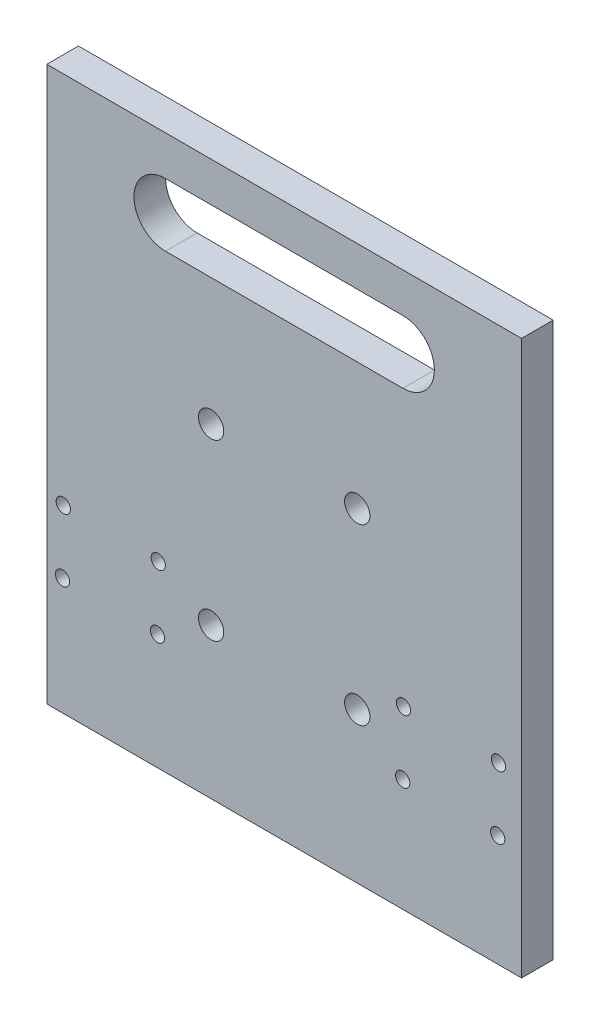
ISO-10303-21;
HEADER;
FILE_DESCRIPTION(('STEP AP214'),'2;1');
FILE_NAME('part.step','',(''),(''),'','','');
FILE_SCHEMA(('AUTOMOTIVE_DESIGN { 1 0 10303 214 1 1 1 1 }'));
ENDSEC;
DATA;
#1=APPLICATION_CONTEXT('core data for automotive mechanical design processes');
#2=APPLICATION_PROTOCOL_DEFINITION('international standard','automotive_design',2000,#1);
#3=PRODUCT_CONTEXT('',#1,'mechanical');
#4=PRODUCT('Part','Part','',(#3));
#5=PRODUCT_RELATED_PRODUCT_CATEGORY('part','',(#4));
#6=PRODUCT_DEFINITION_FORMATION('','',#4);
#7=PRODUCT_DEFINITION_CONTEXT('part definition',#1,'design');
#8=PRODUCT_DEFINITION('design','',#6,#7);
#9=PRODUCT_DEFINITION_SHAPE('','',#8);
#10=(LENGTH_UNIT() NAMED_UNIT(*) SI_UNIT(.MILLI.,.METRE.));
#11=(NAMED_UNIT(*) PLANE_ANGLE_UNIT() SI_UNIT($,.RADIAN.));
#12=(NAMED_UNIT(*) SI_UNIT($,.STERADIAN.) SOLID_ANGLE_UNIT());
#13=UNCERTAINTY_MEASURE_WITH_UNIT(LENGTH_MEASURE(1.E-05),#10,'distance_accuracy_value','');
#14=(GEOMETRIC_REPRESENTATION_CONTEXT(3) GLOBAL_UNCERTAINTY_ASSIGNED_CONTEXT((#13)) GLOBAL_UNIT_ASSIGNED_CONTEXT((#10,
#11,#12)) REPRESENTATION_CONTEXT('',''));
#15=CARTESIAN_POINT('',(0.,0.,0.));
#16=DIRECTION('',(0.,0.,1.));
#17=DIRECTION('',(1.,0.,0.));
#18=AXIS2_PLACEMENT_3D('',#15,#16,#17);
#19=CARTESIAN_POINT('',(-33.5645284175336,-20.6339003676277,0.));
#20=DIRECTION('',(0.,-1.,0.));
#21=DIRECTION('',(-1.,0.,0.));
#22=AXIS2_PLACEMENT_3D('',#19,#20,#21);
#23=PLANE('',#22);
#24=DIRECTION('',(1.,0.,0.));
#25=VECTOR('',#24,1.);
#26=CARTESIAN_POINT('',(-33.5645284175336,-20.6339003676277,0.));
#27=LINE('',#26,#25);
#28=CARTESIAN_POINT('',(-33.5645284175336,-20.6339003676277,0.));
#29=VERTEX_POINT('',#28);
#30=CARTESIAN_POINT('',(26.4354715824664,-20.6339003676277,0.));
#31=VERTEX_POINT('',#30);
#32=EDGE_CURVE('E263',#29,#31,#27,.T.);
#33=ORIENTED_EDGE('',*,*,#32,.T.);
#34=DIRECTION('',(0.,0.,1.));
#35=VECTOR('',#34,1.);
#36=CARTESIAN_POINT('',(26.4354715824664,-20.6339003676277,0.));
#37=LINE('',#36,#35);
#38=CARTESIAN_POINT('',(26.4354715824664,-20.6339003676277,4.));
#39=VERTEX_POINT('',#38);
#40=EDGE_CURVE('E11',#31,#39,#37,.T.);
#41=ORIENTED_EDGE('',*,*,#40,.T.);
#42=DIRECTION('',(1.,0.,0.));
#43=VECTOR('',#42,1.);
#44=CARTESIAN_POINT('',(-33.5645284175336,-20.6339003676277,4.));
#45=LINE('',#44,#43);
#46=CARTESIAN_POINT('',(-33.5645284175336,-20.6339003676277,4.));
#47=VERTEX_POINT('',#46);
#48=EDGE_CURVE('E228',#47,#39,#45,.T.);
#49=ORIENTED_EDGE('',*,*,#48,.F.);
#50=DIRECTION('',(0.,0.,1.));
#51=VECTOR('',#50,1.);
#52=CARTESIAN_POINT('',(-33.5645284175336,-20.6339003676277,0.));
#53=LINE('',#52,#51);
#54=EDGE_CURVE('E213',#29,#47,#53,.T.);
#55=ORIENTED_EDGE('',*,*,#54,.F.);
#56=EDGE_LOOP('',(#33,#41,#49,#55));
#57=FACE_BOUND('',#56,.T.);
#58=ADVANCED_FACE('F16',(#57),#23,.T.);
#59=CARTESIAN_POINT('',(26.4354715824664,-20.6339003676277,0.));
#60=DIRECTION('',(1.,0.,0.));
#61=DIRECTION('',(0.,-1.,0.));
#62=AXIS2_PLACEMENT_3D('',#59,#60,#61);
#63=PLANE('',#62);
#64=DIRECTION('',(0.,1.,0.));
#65=VECTOR('',#64,1.);
#66=CARTESIAN_POINT('',(26.4354715824664,-20.6339003676277,0.));
#67=LINE('',#66,#65);
#68=CARTESIAN_POINT('',(26.4354715824664,49.3660996323723,0.));
#69=VERTEX_POINT('',#68);
#70=EDGE_CURVE('E302',#31,#69,#67,.T.);
#71=ORIENTED_EDGE('',*,*,#70,.T.);
#72=DIRECTION('',(0.,0.,1.));
#73=VECTOR('',#72,1.);
#74=CARTESIAN_POINT('',(26.4354715824664,49.3660996323723,0.));
#75=LINE('',#74,#73);
#76=CARTESIAN_POINT('',(26.4354715824664,49.3660996323723,4.));
#77=VERTEX_POINT('',#76);
#78=EDGE_CURVE('E26',#69,#77,#75,.T.);
#79=ORIENTED_EDGE('',*,*,#78,.T.);
#80=DIRECTION('',(0.,1.,0.));
#81=VECTOR('',#80,1.);
#82=CARTESIAN_POINT('',(26.4354715824664,-20.6339003676277,4.));
#83=LINE('',#82,#81);
#84=EDGE_CURVE('E237',#39,#77,#83,.T.);
#85=ORIENTED_EDGE('',*,*,#84,.F.);
#86=ORIENTED_EDGE('',*,*,#40,.F.);
#87=EDGE_LOOP('',(#71,#79,#85,#86));
#88=FACE_BOUND('',#87,.T.);
#89=ADVANCED_FACE('F339',(#88),#63,.T.);
#90=CARTESIAN_POINT('',(26.4354715824664,49.3660996323723,0.));
#91=DIRECTION('',(0.,1.,0.));
#92=DIRECTION('',(1.,0.,0.));
#93=AXIS2_PLACEMENT_3D('',#90,#91,#92);
#94=PLANE('',#93);
#95=DIRECTION('',(-1.,0.,0.));
#96=VECTOR('',#95,1.);
#97=CARTESIAN_POINT('',(26.4354715824664,49.3660996323723,0.));
#98=LINE('',#97,#96);
#99=CARTESIAN_POINT('',(-33.5645284175336,49.3660996323723,0.));
#100=VERTEX_POINT('',#99);
#101=EDGE_CURVE('E298',#69,#100,#98,.T.);
#102=ORIENTED_EDGE('',*,*,#101,.T.);
#103=DIRECTION('',(0.,0.,1.));
#104=VECTOR('',#103,1.);
#105=CARTESIAN_POINT('',(-33.5645284175336,49.3660996323723,0.));
#106=LINE('',#105,#104);
#107=CARTESIAN_POINT('',(-33.5645284175336,49.3660996323723,4.));
#108=VERTEX_POINT('',#107);
#109=EDGE_CURVE('E210',#100,#108,#106,.T.);
#110=ORIENTED_EDGE('',*,*,#109,.T.);
#111=DIRECTION('',(-1.,0.,0.));
#112=VECTOR('',#111,1.);
#113=CARTESIAN_POINT('',(26.4354715824664,49.3660996323723,4.));
#114=LINE('',#113,#112);
#115=EDGE_CURVE('E19',#77,#108,#114,.T.);
#116=ORIENTED_EDGE('',*,*,#115,.F.);
#117=ORIENTED_EDGE('',*,*,#78,.F.);
#118=EDGE_LOOP('',(#102,#110,#116,#117));
#119=FACE_BOUND('',#118,.T.);
#120=ADVANCED_FACE('F348',(#119),#94,.T.);
#121=CARTESIAN_POINT('',(-33.5645284175336,49.3660996323723,0.));
#122=DIRECTION('',(-1.,0.,0.));
#123=DIRECTION('',(0.,0.,1.));
#124=AXIS2_PLACEMENT_3D('',#121,#122,#123);
#125=PLANE('',#124);
#126=DIRECTION('',(0.,-1.,0.));
#127=VECTOR('',#126,1.);
#128=CARTESIAN_POINT('',(-33.5645284175336,49.3660996323723,0.));
#129=LINE('',#128,#127);
#130=EDGE_CURVE('E303',#100,#29,#129,.T.);
#131=ORIENTED_EDGE('',*,*,#130,.T.);
#132=ORIENTED_EDGE('',*,*,#54,.T.);
#133=DIRECTION('',(0.,-1.,0.));
#134=VECTOR('',#133,1.);
#135=CARTESIAN_POINT('',(-33.5645284175336,49.3660996323723,4.));
#136=LINE('',#135,#134);
#137=EDGE_CURVE('E276',#108,#47,#136,.T.);
#138=ORIENTED_EDGE('',*,*,#137,.F.);
#139=ORIENTED_EDGE('',*,*,#109,.F.);
#140=EDGE_LOOP('',(#131,#132,#138,#139));
#141=FACE_BOUND('',#140,.T.);
#142=ADVANCED_FACE('F346',(#141),#125,.T.);
#143=CARTESIAN_POINT('',(11.4354715824664,44.3660996323723,0.));
#144=DIRECTION('',(0.,1.,0.));
#145=DIRECTION('',(1.,0.,0.));
#146=AXIS2_PLACEMENT_3D('',#143,#144,#145);
#147=PLANE('',#146);
#148=DIRECTION('',(1.,0.,0.));
#149=VECTOR('',#148,1.);
#150=CARTESIAN_POINT('',(11.4354715824664,44.3660996323723,4.));
#151=LINE('',#150,#149);
#152=CARTESIAN_POINT('',(-18.5645284175336,44.3660996323723,4.));
#153=VERTEX_POINT('',#152);
#154=CARTESIAN_POINT('',(11.4354715824664,44.3660996323723,4.));
#155=VERTEX_POINT('',#154);
#156=EDGE_CURVE('E269',#153,#155,#151,.T.);
#157=ORIENTED_EDGE('',*,*,#156,.F.);
#158=DIRECTION('',(0.,0.,1.));
#159=VECTOR('',#158,1.);
#160=CARTESIAN_POINT('',(-18.5645284175336,44.3660996323723,0.));
#161=LINE('',#160,#159);
#162=CARTESIAN_POINT('',(-18.5645284175336,44.3660996323723,0.));
#163=VERTEX_POINT('',#162);
#164=EDGE_CURVE('E250',#163,#153,#161,.T.);
#165=ORIENTED_EDGE('',*,*,#164,.F.);
#166=DIRECTION('',(-1.,0.,0.));
#167=VECTOR('',#166,1.);
#168=CARTESIAN_POINT('',(11.4354715824664,44.3660996323723,0.));
#169=LINE('',#168,#167);
#170=CARTESIAN_POINT('',(11.4354715824664,44.3660996323723,0.));
#171=VERTEX_POINT('',#170);
#172=EDGE_CURVE('E258',#171,#163,#169,.T.);
#173=ORIENTED_EDGE('',*,*,#172,.F.);
#174=DIRECTION('',(0.,0.,1.));
#175=VECTOR('',#174,1.);
#176=CARTESIAN_POINT('',(11.4354715824664,44.3660996323723,0.));
#177=LINE('',#176,#175);
#178=EDGE_CURVE('E284',#171,#155,#177,.T.);
#179=ORIENTED_EDGE('',*,*,#178,.T.);
#180=EDGE_LOOP('',(#157,#165,#173,#179));
#181=FACE_BOUND('',#180,.T.);
#182=ADVANCED_FACE('F563',(#181),#147,.F.);
#183=CARTESIAN_POINT('',(-18.5645284175336,40.3860996323723,0.));
#184=DIRECTION('',(0.,0.,1.));
#185=DIRECTION('',(0.,1.,0.));
#186=AXIS2_PLACEMENT_3D('',#183,#184,#185);
#187=CYLINDRICAL_SURFACE('',#186,3.98);
#188=CARTESIAN_POINT('',(-18.5645284175336,40.3860996323723,4.));
#189=DIRECTION('',(0.,0.,-1.));
#190=DIRECTION('',(0.,1.,0.));
#191=AXIS2_PLACEMENT_3D('',#188,#189,#190);
#192=CIRCLE('',#191,3.98);
#193=CARTESIAN_POINT('',(-18.5645284175336,36.4060996323723,4.));
#194=VERTEX_POINT('',#193);
#195=EDGE_CURVE('E204',#194,#153,#192,.T.);
#196=ORIENTED_EDGE('',*,*,#195,.F.);
#197=DIRECTION('',(0.,0.,1.));
#198=VECTOR('',#197,1.);
#199=CARTESIAN_POINT('',(-18.5645284175336,36.4060996323723,0.));
#200=LINE('',#199,#198);
#201=CARTESIAN_POINT('',(-18.5645284175336,36.4060996323723,0.));
#202=VERTEX_POINT('',#201);
#203=EDGE_CURVE('E288',#202,#194,#200,.T.);
#204=ORIENTED_EDGE('',*,*,#203,.F.);
#205=CARTESIAN_POINT('',(-18.5645284175336,40.3860996323723,0.));
#206=DIRECTION('',(0.,0.,1.));
#207=DIRECTION('',(0.,1.,0.));
#208=AXIS2_PLACEMENT_3D('',#205,#206,#207);
#209=CIRCLE('',#208,3.98);
#210=EDGE_CURVE('E262',#163,#202,#209,.T.);
#211=ORIENTED_EDGE('',*,*,#210,.F.);
#212=ORIENTED_EDGE('',*,*,#164,.T.);
#213=EDGE_LOOP('',(#196,#204,#211,#212));
#214=FACE_BOUND('',#213,.T.);
#215=ADVANCED_FACE('F566',(#214),#187,.F.);
#216=CARTESIAN_POINT('',(-18.5645284175336,36.4060996323723,0.));
#217=DIRECTION('',(0.,-1.,0.));
#218=DIRECTION('',(0.,0.,-1.));
#219=AXIS2_PLACEMENT_3D('',#216,#217,#218);
#220=PLANE('',#219);
#221=DIRECTION('',(-1.,0.,0.));
#222=VECTOR('',#221,1.);
#223=CARTESIAN_POINT('',(-18.5645284175336,36.4060996323723,4.));
#224=LINE('',#223,#222);
#225=CARTESIAN_POINT('',(11.4354715824664,36.4060996323723,4.));
#226=VERTEX_POINT('',#225);
#227=EDGE_CURVE('E268',#226,#194,#224,.T.);
#228=ORIENTED_EDGE('',*,*,#227,.F.);
#229=DIRECTION('',(0.,0.,1.));
#230=VECTOR('',#229,1.);
#231=CARTESIAN_POINT('',(11.4354715824664,36.4060996323723,0.));
#232=LINE('',#231,#230);
#233=CARTESIAN_POINT('',(11.4354715824664,36.4060996323723,0.));
#234=VERTEX_POINT('',#233);
#235=EDGE_CURVE('E287',#234,#226,#232,.T.);
#236=ORIENTED_EDGE('',*,*,#235,.F.);
#237=DIRECTION('',(1.,0.,0.));
#238=VECTOR('',#237,1.);
#239=CARTESIAN_POINT('',(-18.5645284175336,36.4060996323723,0.));
#240=LINE('',#239,#238);
#241=EDGE_CURVE('E221',#202,#234,#240,.T.);
#242=ORIENTED_EDGE('',*,*,#241,.F.);
#243=ORIENTED_EDGE('',*,*,#203,.T.);
#244=EDGE_LOOP('',(#228,#236,#242,#243));
#245=FACE_BOUND('',#244,.T.);
#246=ADVANCED_FACE('F602',(#245),#220,.F.);
#247=CARTESIAN_POINT('',(11.4354715824664,40.3860996323723,0.));
#248=DIRECTION('',(0.,0.,1.));
#249=DIRECTION('',(0.,-1.,0.));
#250=AXIS2_PLACEMENT_3D('',#247,#248,#249);
#251=CYLINDRICAL_SURFACE('',#250,3.98);
#252=CARTESIAN_POINT('',(11.4354715824664,40.3860996323723,4.));
#253=DIRECTION('',(0.,0.,-1.));
#254=DIRECTION('',(0.,-1.,0.));
#255=AXIS2_PLACEMENT_3D('',#252,#253,#254);
#256=CIRCLE('',#255,3.98);
#257=EDGE_CURVE('E264',#155,#226,#256,.T.);
#258=ORIENTED_EDGE('',*,*,#257,.F.);
#259=ORIENTED_EDGE('',*,*,#178,.F.);
#260=CARTESIAN_POINT('',(11.4354715824664,40.3860996323723,0.));
#261=DIRECTION('',(0.,0.,1.));
#262=DIRECTION('',(0.,-1.,0.));
#263=AXIS2_PLACEMENT_3D('',#260,#261,#262);
#264=CIRCLE('',#263,3.98);
#265=EDGE_CURVE('E216',#234,#171,#264,.T.);
#266=ORIENTED_EDGE('',*,*,#265,.F.);
#267=ORIENTED_EDGE('',*,*,#235,.T.);
#268=EDGE_LOOP('',(#258,#259,#266,#267));
#269=FACE_BOUND('',#268,.T.);
#270=ADVANCED_FACE('F598',(#269),#251,.F.);
#271=CARTESIAN_POINT('',(5.67170397350251,20.3660996324462,0.));
#272=DIRECTION('',(0.,0.,1.));
#273=DIRECTION('',(1.,0.,0.));
#274=AXIS2_PLACEMENT_3D('',#271,#272,#273);
#275=CYLINDRICAL_SURFACE('',#274,1.6);
#276=CARTESIAN_POINT('',(5.67170397350251,20.3660996324462,4.));
#277=DIRECTION('',(0.,0.,-1.));
#278=DIRECTION('',(1.,0.,0.));
#279=AXIS2_PLACEMENT_3D('',#276,#277,#278);
#280=CIRCLE('',#279,1.6);
#281=CARTESIAN_POINT('',(7.27170397350251,20.3660996324462,4.));
#282=VERTEX_POINT('',#281);
#283=EDGE_CURVE('E199',#282,#282,#280,.T.);
#284=ORIENTED_EDGE('',*,*,#283,.F.);
#285=EDGE_LOOP('',(#284));
#286=FACE_BOUND('',#285,.T.);
#287=CARTESIAN_POINT('',(5.67170397350251,20.3660996324462,0.));
#288=DIRECTION('',(0.,0.,1.));
#289=DIRECTION('',(1.,0.,0.));
#290=AXIS2_PLACEMENT_3D('',#287,#288,#289);
#291=CIRCLE('',#290,1.6);
#292=CARTESIAN_POINT('',(7.27170397350251,20.3660996324462,0.));
#293=VERTEX_POINT('',#292);
#294=EDGE_CURVE('E220',#293,#293,#291,.T.);
#295=ORIENTED_EDGE('',*,*,#294,.F.);
#296=EDGE_LOOP('',(#295));
#297=FACE_BOUND('',#296,.T.);
#298=ADVANCED_FACE('F628',(#286,#297),#275,.F.);
#299=CARTESIAN_POINT('',(-12.8007608085658,20.3660996324462,0.));
#300=DIRECTION('',(0.,0.,1.));
#301=DIRECTION('',(1.,0.,0.));
#302=AXIS2_PLACEMENT_3D('',#299,#300,#301);
#303=CYLINDRICAL_SURFACE('',#302,1.6);
#304=CARTESIAN_POINT('',(-12.8007608085658,20.3660996324462,4.));
#305=DIRECTION('',(0.,0.,-1.));
#306=DIRECTION('',(1.,0.,0.));
#307=AXIS2_PLACEMENT_3D('',#304,#305,#306);
#308=CIRCLE('',#307,1.6);
#309=CARTESIAN_POINT('',(-11.2007608085658,20.3660996324462,4.));
#310=VERTEX_POINT('',#309);
#311=EDGE_CURVE('E203',#310,#310,#308,.T.);
#312=ORIENTED_EDGE('',*,*,#311,.F.);
#313=EDGE_LOOP('',(#312));
#314=FACE_BOUND('',#313,.T.);
#315=CARTESIAN_POINT('',(-12.8007608085658,20.3660996324462,0.));
#316=DIRECTION('',(0.,0.,1.));
#317=DIRECTION('',(1.,0.,0.));
#318=AXIS2_PLACEMENT_3D('',#315,#316,#317);
#319=CIRCLE('',#318,1.6);
#320=CARTESIAN_POINT('',(-11.2007608085658,20.3660996324462,0.));
#321=VERTEX_POINT('',#320);
#322=EDGE_CURVE('E193',#321,#321,#319,.T.);
#323=ORIENTED_EDGE('',*,*,#322,.F.);
#324=EDGE_LOOP('',(#323));
#325=FACE_BOUND('',#324,.T.);
#326=ADVANCED_FACE('F561',(#314,#325),#303,.F.);
#327=CARTESIAN_POINT('',(5.67170397350251,-1.63390036755377,0.));
#328=DIRECTION('',(0.,0.,1.));
#329=DIRECTION('',(1.,0.,0.));
#330=AXIS2_PLACEMENT_3D('',#327,#328,#329);
#331=CYLINDRICAL_SURFACE('',#330,1.6);
#332=CARTESIAN_POINT('',(5.67170397350251,-1.63390036755377,4.));
#333=DIRECTION('',(0.,0.,-1.));
#334=DIRECTION('',(1.,0.,0.));
#335=AXIS2_PLACEMENT_3D('',#332,#333,#334);
#336=CIRCLE('',#335,1.6);
#337=CARTESIAN_POINT('',(7.27170397350251,-1.63390036755377,4.));
#338=VERTEX_POINT('',#337);
#339=EDGE_CURVE('E283',#338,#338,#336,.T.);
#340=ORIENTED_EDGE('',*,*,#339,.F.);
#341=EDGE_LOOP('',(#340));
#342=FACE_BOUND('',#341,.T.);
#343=CARTESIAN_POINT('',(5.67170397350251,-1.63390036755377,0.));
#344=DIRECTION('',(0.,0.,1.));
#345=DIRECTION('',(1.,0.,0.));
#346=AXIS2_PLACEMENT_3D('',#343,#344,#345);
#347=CIRCLE('',#346,1.6);
#348=CARTESIAN_POINT('',(7.27170397350251,-1.63390036755377,0.));
#349=VERTEX_POINT('',#348);
#350=EDGE_CURVE('E184',#349,#349,#347,.T.);
#351=ORIENTED_EDGE('',*,*,#350,.F.);
#352=EDGE_LOOP('',(#351));
#353=FACE_BOUND('',#352,.T.);
#354=ADVANCED_FACE('F542',(#342,#353),#331,.F.);
#355=CARTESIAN_POINT('',(-12.8007608085658,-1.63390036755377,0.));
#356=DIRECTION('',(0.,0.,1.));
#357=DIRECTION('',(1.,0.,0.));
#358=AXIS2_PLACEMENT_3D('',#355,#356,#357);
#359=CYLINDRICAL_SURFACE('',#358,1.6);
#360=CARTESIAN_POINT('',(-12.8007608085658,-1.63390036755377,4.));
#361=DIRECTION('',(0.,0.,-1.));
#362=DIRECTION('',(1.,0.,0.));
#363=AXIS2_PLACEMENT_3D('',#360,#361,#362);
#364=CIRCLE('',#363,1.6);
#365=CARTESIAN_POINT('',(-11.2007608085658,-1.63390036755377,4.));
#366=VERTEX_POINT('',#365);
#367=EDGE_CURVE('E244',#366,#366,#364,.T.);
#368=ORIENTED_EDGE('',*,*,#367,.F.);
#369=EDGE_LOOP('',(#368));
#370=FACE_BOUND('',#369,.T.);
#371=CARTESIAN_POINT('',(-12.8007608085658,-1.63390036755377,0.));
#372=DIRECTION('',(0.,0.,1.));
#373=DIRECTION('',(1.,0.,0.));
#374=AXIS2_PLACEMENT_3D('',#371,#372,#373);
#375=CIRCLE('',#374,1.6);
#376=CARTESIAN_POINT('',(-11.2007608085658,-1.63390036755377,0.));
#377=VERTEX_POINT('',#376);
#378=EDGE_CURVE('E178',#377,#377,#375,.T.);
#379=ORIENTED_EDGE('',*,*,#378,.F.);
#380=EDGE_LOOP('',(#379));
#381=FACE_BOUND('',#380,.T.);
#382=ADVANCED_FACE('F532',(#370,#381),#359,.F.);
#383=CARTESIAN_POINT('',(-31.5760191399621,-5.86398969413833,0.));
#384=DIRECTION('',(0.,0.,1.));
#385=DIRECTION('',(-1.,0.,0.));
#386=AXIS2_PLACEMENT_3D('',#383,#384,#385);
#387=CYLINDRICAL_SURFACE('',#386,0.9);
#388=CARTESIAN_POINT('',(-31.5760191399621,-5.86398969413833,4.));
#389=DIRECTION('',(0.,0.,-1.));
#390=DIRECTION('',(-1.,0.,0.));
#391=AXIS2_PLACEMENT_3D('',#388,#389,#390);
#392=CIRCLE('',#391,0.9);
#393=CARTESIAN_POINT('',(-32.4760191399621,-5.86398969413833,4.));
#394=VERTEX_POINT('',#393);
#395=EDGE_CURVE('E241',#394,#394,#392,.T.);
#396=ORIENTED_EDGE('',*,*,#395,.F.);
#397=EDGE_LOOP('',(#396));
#398=FACE_BOUND('',#397,.T.);
#399=CARTESIAN_POINT('',(-31.5760191399621,-5.86398969413833,0.));
#400=DIRECTION('',(0.,0.,1.));
#401=DIRECTION('',(-1.,0.,0.));
#402=AXIS2_PLACEMENT_3D('',#399,#400,#401);
#403=CIRCLE('',#402,0.9);
#404=CARTESIAN_POINT('',(-32.4760191399621,-5.86398969413833,0.));
#405=VERTEX_POINT('',#404);
#406=EDGE_CURVE('E183',#405,#405,#403,.T.);
#407=ORIENTED_EDGE('',*,*,#406,.F.);
#408=EDGE_LOOP('',(#407));
#409=FACE_BOUND('',#408,.T.);
#410=ADVANCED_FACE('F529',(#398,#409),#387,.F.);
#411=CARTESIAN_POINT('',(11.4173912721792,-6.39705524438828,0.));
#412=DIRECTION('',(0.,0.,1.));
#413=DIRECTION('',(-1.,0.,0.));
#414=AXIS2_PLACEMENT_3D('',#411,#412,#413);
#415=CYLINDRICAL_SURFACE('',#414,0.9);
#416=CARTESIAN_POINT('',(11.4173912721792,-6.39705524438828,4.));
#417=DIRECTION('',(0.,0.,-1.));
#418=DIRECTION('',(-1.,0.,0.));
#419=AXIS2_PLACEMENT_3D('',#416,#417,#418);
#420=CIRCLE('',#419,0.9);
#421=CARTESIAN_POINT('',(10.5173912721792,-6.39705524438828,4.));
#422=VERTEX_POINT('',#421);
#423=EDGE_CURVE('E243',#422,#422,#420,.T.);
#424=ORIENTED_EDGE('',*,*,#423,.F.);
#425=EDGE_LOOP('',(#424));
#426=FACE_BOUND('',#425,.T.);
#427=CARTESIAN_POINT('',(11.4173912721792,-6.39705524438828,0.));
#428=DIRECTION('',(0.,0.,1.));
#429=DIRECTION('',(-1.,0.,0.));
#430=AXIS2_PLACEMENT_3D('',#427,#428,#429);
#431=CIRCLE('',#430,0.9);
#432=CARTESIAN_POINT('',(10.5173912721792,-6.39705524438828,0.));
#433=VERTEX_POINT('',#432);
#434=EDGE_CURVE('E191',#433,#433,#431,.T.);
#435=ORIENTED_EDGE('',*,*,#434,.F.);
#436=EDGE_LOOP('',(#435));
#437=FACE_BOUND('',#436,.T.);
#438=ADVANCED_FACE('F531',(#426,#437),#415,.F.);
#439=CARTESIAN_POINT('',(11.5165738354404,1.60232990818093,0.));
#440=DIRECTION('',(0.,0.,1.));
#441=DIRECTION('',(-1.,0.,0.));
#442=AXIS2_PLACEMENT_3D('',#439,#440,#441);
#443=CYLINDRICAL_SURFACE('',#442,0.9);
#444=CARTESIAN_POINT('',(11.5165738354404,1.60232990818093,4.));
#445=DIRECTION('',(0.,0.,-1.));
#446=DIRECTION('',(-1.,0.,0.));
#447=AXIS2_PLACEMENT_3D('',#444,#445,#446);
#448=CIRCLE('',#447,0.9);
#449=CARTESIAN_POINT('',(10.6165738354404,1.60232990818093,4.));
#450=VERTEX_POINT('',#449);
#451=EDGE_CURVE('E254',#450,#450,#448,.T.);
#452=ORIENTED_EDGE('',*,*,#451,.F.);
#453=EDGE_LOOP('',(#452));
#454=FACE_BOUND('',#453,.T.);
#455=CARTESIAN_POINT('',(11.5165738354404,1.60232990818093,0.));
#456=DIRECTION('',(0.,0.,1.));
#457=DIRECTION('',(-1.,0.,0.));
#458=AXIS2_PLACEMENT_3D('',#455,#456,#457);
#459=CIRCLE('',#458,0.9);
#460=CARTESIAN_POINT('',(10.6165738354404,1.60232990818093,0.));
#461=VERTEX_POINT('',#460);
#462=EDGE_CURVE('E317',#461,#461,#459,.T.);
#463=ORIENTED_EDGE('',*,*,#462,.F.);
#464=EDGE_LOOP('',(#463));
#465=FACE_BOUND('',#464,.T.);
#466=ADVANCED_FACE('F515',(#454,#465),#443,.F.);
#467=CARTESIAN_POINT('',(23.4164690010331,-6.54582908928004,0.));
#468=DIRECTION('',(0.,0.,1.));
#469=DIRECTION('',(-1.,0.,0.));
#470=AXIS2_PLACEMENT_3D('',#467,#468,#469);
#471=CYLINDRICAL_SURFACE('',#470,0.9);
#472=CARTESIAN_POINT('',(23.4164690010331,-6.54582908928004,4.));
#473=DIRECTION('',(0.,0.,-1.));
#474=DIRECTION('',(-1.,0.,0.));
#475=AXIS2_PLACEMENT_3D('',#472,#473,#474);
#476=CIRCLE('',#475,0.9);
#477=CARTESIAN_POINT('',(22.5164690010331,-6.54582908928004,4.));
#478=VERTEX_POINT('',#477);
#479=EDGE_CURVE('E197',#478,#478,#476,.T.);
#480=ORIENTED_EDGE('',*,*,#479,.F.);
#481=EDGE_LOOP('',(#480));
#482=FACE_BOUND('',#481,.T.);
#483=CARTESIAN_POINT('',(23.4164690010331,-6.54582908928004,0.));
#484=DIRECTION('',(0.,0.,1.));
#485=DIRECTION('',(-1.,0.,0.));
#486=AXIS2_PLACEMENT_3D('',#483,#484,#485);
#487=CIRCLE('',#486,0.9);
#488=CARTESIAN_POINT('',(22.5164690010331,-6.54582908928004,0.));
#489=VERTEX_POINT('',#488);
#490=EDGE_CURVE('E236',#489,#489,#487,.T.);
#491=ORIENTED_EDGE('',*,*,#490,.F.);
#492=EDGE_LOOP('',(#491));
#493=FACE_BOUND('',#492,.T.);
#494=ADVANCED_FACE('F511',(#482,#493),#471,.F.);
#495=CARTESIAN_POINT('',(-19.5769414111083,-6.01276353903009,0.));
#496=DIRECTION('',(0.,0.,1.));
#497=DIRECTION('',(-1.,0.,0.));
#498=AXIS2_PLACEMENT_3D('',#495,#496,#497);
#499=CYLINDRICAL_SURFACE('',#498,0.9);
#500=CARTESIAN_POINT('',(-19.5769414111083,-6.01276353903009,4.));
#501=DIRECTION('',(0.,0.,-1.));
#502=DIRECTION('',(-1.,0.,0.));
#503=AXIS2_PLACEMENT_3D('',#500,#501,#502);
#504=CIRCLE('',#503,0.9);
#505=CARTESIAN_POINT('',(-20.4769414111083,-6.01276353903009,4.));
#506=VERTEX_POINT('',#505);
#507=EDGE_CURVE('E205',#506,#506,#504,.T.);
#508=ORIENTED_EDGE('',*,*,#507,.F.);
#509=EDGE_LOOP('',(#508));
#510=FACE_BOUND('',#509,.T.);
#511=CARTESIAN_POINT('',(-19.5769414111083,-6.01276353903009,0.));
#512=DIRECTION('',(0.,0.,1.));
#513=DIRECTION('',(-1.,0.,0.));
#514=AXIS2_PLACEMENT_3D('',#511,#512,#513);
#515=CIRCLE('',#514,0.9);
#516=CARTESIAN_POINT('',(-20.4769414111083,-6.01276353903009,0.));
#517=VERTEX_POINT('',#516);
#518=EDGE_CURVE('E232',#517,#517,#515,.T.);
#519=ORIENTED_EDGE('',*,*,#518,.F.);
#520=EDGE_LOOP('',(#519));
#521=FACE_BOUND('',#520,.T.);
#522=ADVANCED_FACE('F514',(#510,#521),#499,.F.);
#523=CARTESIAN_POINT('',(-19.4777588478471,1.98662161353914,0.));
#524=DIRECTION('',(0.,0.,1.));
#525=DIRECTION('',(-1.,0.,0.));
#526=AXIS2_PLACEMENT_3D('',#523,#524,#525);
#527=CYLINDRICAL_SURFACE('',#526,0.9);
#528=CARTESIAN_POINT('',(-19.4777588478471,1.98662161353914,4.));
#529=DIRECTION('',(0.,0.,-1.));
#530=DIRECTION('',(-1.,0.,0.));
#531=AXIS2_PLACEMENT_3D('',#528,#529,#530);
#532=CIRCLE('',#531,0.9);
#533=CARTESIAN_POINT('',(-20.3777588478471,1.98662161353914,4.));
#534=VERTEX_POINT('',#533);
#535=EDGE_CURVE('E209',#534,#534,#532,.T.);
#536=ORIENTED_EDGE('',*,*,#535,.F.);
#537=EDGE_LOOP('',(#536));
#538=FACE_BOUND('',#537,.T.);
#539=CARTESIAN_POINT('',(-19.4777588478471,1.98662161353914,0.));
#540=DIRECTION('',(0.,0.,1.));
#541=DIRECTION('',(-1.,0.,0.));
#542=AXIS2_PLACEMENT_3D('',#539,#540,#541);
#543=CIRCLE('',#542,0.9);
#544=CARTESIAN_POINT('',(-20.3777588478471,1.98662161353914,0.));
#545=VERTEX_POINT('',#544);
#546=EDGE_CURVE('E235',#545,#545,#543,.T.);
#547=ORIENTED_EDGE('',*,*,#546,.F.);
#548=EDGE_LOOP('',(#547));
#549=FACE_BOUND('',#548,.T.);
#550=ADVANCED_FACE('F618',(#538,#549),#527,.F.);
#551=CARTESIAN_POINT('',(23.5156515642942,1.45355606328918,0.));
#552=DIRECTION('',(0.,0.,1.));
#553=DIRECTION('',(-1.,0.,0.));
#554=AXIS2_PLACEMENT_3D('',#551,#552,#553);
#555=CYLINDRICAL_SURFACE('',#554,0.9);
#556=CARTESIAN_POINT('',(23.5156515642942,1.45355606328918,4.));
#557=DIRECTION('',(0.,0.,-1.));
#558=DIRECTION('',(-1.,0.,0.));
#559=AXIS2_PLACEMENT_3D('',#556,#557,#558);
#560=CIRCLE('',#559,0.9);
#561=CARTESIAN_POINT('',(22.6156515642942,1.45355606328918,4.));
#562=VERTEX_POINT('',#561);
#563=EDGE_CURVE('E223',#562,#562,#560,.T.);
#564=ORIENTED_EDGE('',*,*,#563,.F.);
#565=EDGE_LOOP('',(#564));
#566=FACE_BOUND('',#565,.T.);
#567=CARTESIAN_POINT('',(23.5156515642942,1.45355606328918,0.));
#568=DIRECTION('',(0.,0.,1.));
#569=DIRECTION('',(-1.,0.,0.));
#570=AXIS2_PLACEMENT_3D('',#567,#568,#569);
#571=CIRCLE('',#570,0.9);
#572=CARTESIAN_POINT('',(22.6156515642942,1.45355606328918,0.));
#573=VERTEX_POINT('',#572);
#574=EDGE_CURVE('E229',#573,#573,#571,.T.);
#575=ORIENTED_EDGE('',*,*,#574,.F.);
#576=EDGE_LOOP('',(#575));
#577=FACE_BOUND('',#576,.T.);
#578=ADVANCED_FACE('F570',(#566,#577),#555,.F.);
#579=CARTESIAN_POINT('',(-31.476836576701,2.13539545843089,0.));
#580=DIRECTION('',(0.,0.,1.));
#581=DIRECTION('',(-1.,0.,0.));
#582=AXIS2_PLACEMENT_3D('',#579,#580,#581);
#583=CYLINDRICAL_SURFACE('',#582,0.9);
#584=CARTESIAN_POINT('',(-31.476836576701,2.13539545843089,4.));
#585=DIRECTION('',(0.,0.,-1.));
#586=DIRECTION('',(-1.,0.,0.));
#587=AXIS2_PLACEMENT_3D('',#584,#585,#586);
#588=CIRCLE('',#587,0.9);
#589=CARTESIAN_POINT('',(-32.376836576701,2.13539545843089,4.));
#590=VERTEX_POINT('',#589);
#591=EDGE_CURVE('E38',#590,#590,#588,.T.);
#592=ORIENTED_EDGE('',*,*,#591,.F.);
#593=EDGE_LOOP('',(#592));
#594=FACE_BOUND('',#593,.T.);
#595=CARTESIAN_POINT('',(-31.476836576701,2.13539545843089,0.));
#596=DIRECTION('',(0.,0.,1.));
#597=DIRECTION('',(-1.,0.,0.));
#598=AXIS2_PLACEMENT_3D('',#595,#596,#597);
#599=CIRCLE('',#598,0.9);
#600=CARTESIAN_POINT('',(-32.376836576701,2.13539545843089,0.));
#601=VERTEX_POINT('',#600);
#602=EDGE_CURVE('E225',#601,#601,#599,.T.);
#603=ORIENTED_EDGE('',*,*,#602,.F.);
#604=EDGE_LOOP('',(#603));
#605=FACE_BOUND('',#604,.T.);
#606=ADVANCED_FACE('F568',(#594,#605),#583,.F.);
#607=CARTESIAN_POINT('',(0.,0.,4.));
#608=DIRECTION('',(0.,0.,1.));
#609=DIRECTION('',(1.,0.,0.));
#610=AXIS2_PLACEMENT_3D('',#607,#608,#609);
#611=PLANE('',#610);
#612=ORIENTED_EDGE('',*,*,#591,.T.);
#613=EDGE_LOOP('',(#612));
#614=FACE_BOUND('',#613,.T.);
#615=ORIENTED_EDGE('',*,*,#563,.T.);
#616=EDGE_LOOP('',(#615));
#617=FACE_BOUND('',#616,.T.);
#618=ORIENTED_EDGE('',*,*,#535,.T.);
#619=EDGE_LOOP('',(#618));
#620=FACE_BOUND('',#619,.T.);
#621=ORIENTED_EDGE('',*,*,#507,.T.);
#622=EDGE_LOOP('',(#621));
#623=FACE_BOUND('',#622,.T.);
#624=ORIENTED_EDGE('',*,*,#479,.T.);
#625=EDGE_LOOP('',(#624));
#626=FACE_BOUND('',#625,.T.);
#627=ORIENTED_EDGE('',*,*,#451,.T.);
#628=EDGE_LOOP('',(#627));
#629=FACE_BOUND('',#628,.T.);
#630=ORIENTED_EDGE('',*,*,#423,.T.);
#631=EDGE_LOOP('',(#630));
#632=FACE_BOUND('',#631,.T.);
#633=ORIENTED_EDGE('',*,*,#395,.T.);
#634=EDGE_LOOP('',(#633));
#635=FACE_BOUND('',#634,.T.);
#636=ORIENTED_EDGE('',*,*,#367,.T.);
#637=EDGE_LOOP('',(#636));
#638=FACE_BOUND('',#637,.T.);
#639=ORIENTED_EDGE('',*,*,#339,.T.);
#640=EDGE_LOOP('',(#639));
#641=FACE_BOUND('',#640,.T.);
#642=ORIENTED_EDGE('',*,*,#311,.T.);
#643=EDGE_LOOP('',(#642));
#644=FACE_BOUND('',#643,.T.);
#645=ORIENTED_EDGE('',*,*,#283,.T.);
#646=EDGE_LOOP('',(#645));
#647=FACE_BOUND('',#646,.T.);
#648=ORIENTED_EDGE('',*,*,#156,.T.);
#649=ORIENTED_EDGE('',*,*,#257,.T.);
#650=ORIENTED_EDGE('',*,*,#227,.T.);
#651=ORIENTED_EDGE('',*,*,#195,.T.);
#652=EDGE_LOOP('',(#648,#649,#650,#651));
#653=FACE_BOUND('',#652,.T.);
#654=ORIENTED_EDGE('',*,*,#48,.T.);
#655=ORIENTED_EDGE('',*,*,#84,.T.);
#656=ORIENTED_EDGE('',*,*,#115,.T.);
#657=ORIENTED_EDGE('',*,*,#137,.T.);
#658=EDGE_LOOP('',(#654,#655,#656,#657));
#659=FACE_BOUND('',#658,.T.);
#660=ADVANCED_FACE('F343',(#614,#617,#620,#623,#626,#629,#632,#635,#638,#641,#644,#647,#653,
#659),#611,.T.);
#661=CARTESIAN_POINT('',(0.,0.,0.));
#662=DIRECTION('',(0.,0.,1.));
#663=DIRECTION('',(1.,0.,0.));
#664=AXIS2_PLACEMENT_3D('',#661,#662,#663);
#665=PLANE('',#664);
#666=ORIENTED_EDGE('',*,*,#602,.T.);
#667=EDGE_LOOP('',(#666));
#668=FACE_BOUND('',#667,.T.);
#669=ORIENTED_EDGE('',*,*,#574,.T.);
#670=EDGE_LOOP('',(#669));
#671=FACE_BOUND('',#670,.T.);
#672=ORIENTED_EDGE('',*,*,#546,.T.);
#673=EDGE_LOOP('',(#672));
#674=FACE_BOUND('',#673,.T.);
#675=ORIENTED_EDGE('',*,*,#518,.T.);
#676=EDGE_LOOP('',(#675));
#677=FACE_BOUND('',#676,.T.);
#678=ORIENTED_EDGE('',*,*,#490,.T.);
#679=EDGE_LOOP('',(#678));
#680=FACE_BOUND('',#679,.T.);
#681=ORIENTED_EDGE('',*,*,#462,.T.);
#682=EDGE_LOOP('',(#681));
#683=FACE_BOUND('',#682,.T.);
#684=ORIENTED_EDGE('',*,*,#434,.T.);
#685=EDGE_LOOP('',(#684));
#686=FACE_BOUND('',#685,.T.);
#687=ORIENTED_EDGE('',*,*,#406,.T.);
#688=EDGE_LOOP('',(#687));
#689=FACE_BOUND('',#688,.T.);
#690=ORIENTED_EDGE('',*,*,#378,.T.);
#691=EDGE_LOOP('',(#690));
#692=FACE_BOUND('',#691,.T.);
#693=ORIENTED_EDGE('',*,*,#350,.T.);
#694=EDGE_LOOP('',(#693));
#695=FACE_BOUND('',#694,.T.);
#696=ORIENTED_EDGE('',*,*,#322,.T.);
#697=EDGE_LOOP('',(#696));
#698=FACE_BOUND('',#697,.T.);
#699=ORIENTED_EDGE('',*,*,#294,.T.);
#700=EDGE_LOOP('',(#699));
#701=FACE_BOUND('',#700,.T.);
#702=ORIENTED_EDGE('',*,*,#172,.T.);
#703=ORIENTED_EDGE('',*,*,#210,.T.);
#704=ORIENTED_EDGE('',*,*,#241,.T.);
#705=ORIENTED_EDGE('',*,*,#265,.T.);
#706=EDGE_LOOP('',(#702,#703,#704,#705));
#707=FACE_BOUND('',#706,.T.);
#708=ORIENTED_EDGE('',*,*,#130,.F.);
#709=ORIENTED_EDGE('',*,*,#101,.F.);
#710=ORIENTED_EDGE('',*,*,#70,.F.);
#711=ORIENTED_EDGE('',*,*,#32,.F.);
#712=EDGE_LOOP('',(#708,#709,#710,#711));
#713=FACE_BOUND('',#712,.T.);
#714=ADVANCED_FACE('F179',(#668,#671,#674,#677,#680,#683,#686,#689,#692,#695,#698,#701,#707,
#713),#665,.F.);
#715=CLOSED_SHELL('',(#58,#89,#120,#142,#182,#215,#246,#270,#298,#326,#354,#382,#410,#438,#466,
#494,#522,#550,#578,#606,#660,#714));
#716=MANIFOLD_SOLID_BREP('B1',#715);
#717=ADVANCED_BREP_SHAPE_REPRESENTATION('',(#18,#716),#14);
#718=SHAPE_DEFINITION_REPRESENTATION(#9,#717);
ENDSEC;
END-ISO-10303-21;
